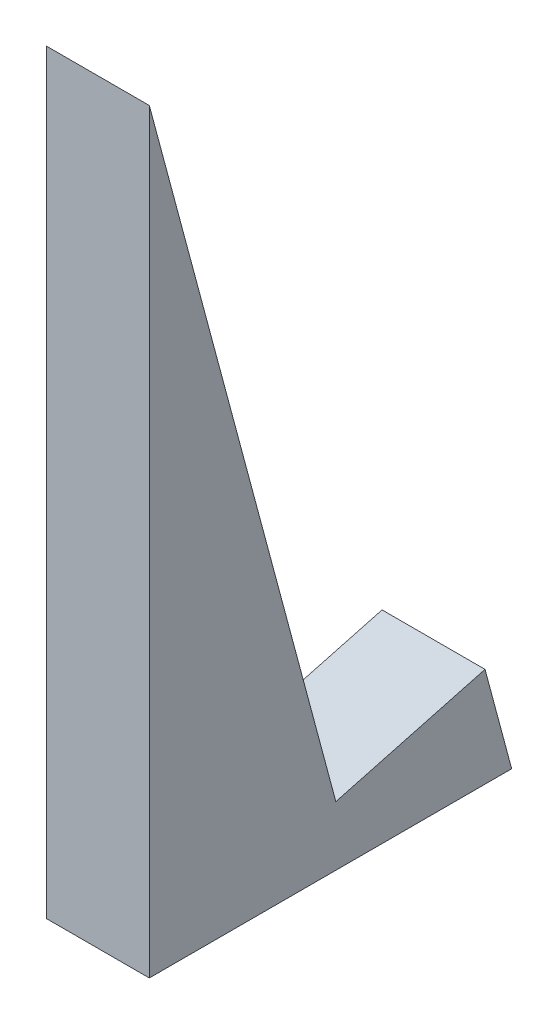
ISO-10303-21;
HEADER;
FILE_DESCRIPTION(('STEP AP214'),'2;1');
FILE_NAME('part.step','',(''),(''),'','','');
FILE_SCHEMA(('AUTOMOTIVE_DESIGN { 1 0 10303 214 1 1 1 1 }'));
ENDSEC;
DATA;
#1=APPLICATION_CONTEXT('core data for automotive mechanical design processes');
#2=APPLICATION_PROTOCOL_DEFINITION('international standard','automotive_design',2000,#1);
#3=PRODUCT_CONTEXT('',#1,'mechanical');
#4=PRODUCT('Part','Part','',(#3));
#5=PRODUCT_RELATED_PRODUCT_CATEGORY('part','',(#4));
#6=PRODUCT_DEFINITION_FORMATION('','',#4);
#7=PRODUCT_DEFINITION_CONTEXT('part definition',#1,'design');
#8=PRODUCT_DEFINITION('design','',#6,#7);
#9=PRODUCT_DEFINITION_SHAPE('','',#8);
#10=(LENGTH_UNIT() NAMED_UNIT(*) SI_UNIT(.MILLI.,.METRE.));
#11=(NAMED_UNIT(*) PLANE_ANGLE_UNIT() SI_UNIT($,.RADIAN.));
#12=(NAMED_UNIT(*) SI_UNIT($,.STERADIAN.) SOLID_ANGLE_UNIT());
#13=UNCERTAINTY_MEASURE_WITH_UNIT(LENGTH_MEASURE(1.E-05),#10,'distance_accuracy_value','');
#14=(GEOMETRIC_REPRESENTATION_CONTEXT(3) GLOBAL_UNCERTAINTY_ASSIGNED_CONTEXT((#13)) GLOBAL_UNIT_ASSIGNED_CONTEXT((#10,
#11,#12)) REPRESENTATION_CONTEXT('',''));
#15=CARTESIAN_POINT('',(0.,0.,0.));
#16=DIRECTION('',(0.,0.,1.));
#17=DIRECTION('',(1.,0.,0.));
#18=AXIS2_PLACEMENT_3D('',#15,#16,#17);
#19=CARTESIAN_POINT('',(10.,73.3917804265875,0.));
#20=DIRECTION('',(0.,0.,-1.));
#21=DIRECTION('',(0.,1.,0.));
#22=AXIS2_PLACEMENT_3D('',#19,#20,#21);
#23=PLANE('',#22);
#24=DIRECTION('',(0.,-1.,0.));
#25=VECTOR('',#24,1.);
#26=CARTESIAN_POINT('',(0.,73.3917804265875,0.));
#27=LINE('',#26,#25);
#28=CARTESIAN_POINT('',(0.,73.3917804265875,0.));
#29=VERTEX_POINT('',#28);
#30=CARTESIAN_POINT('',(0.,0.,0.));
#31=VERTEX_POINT('',#30);
#32=EDGE_CURVE('E107',#29,#31,#27,.T.);
#33=ORIENTED_EDGE('',*,*,#32,.T.);
#34=DIRECTION('',(-1.,0.,0.));
#35=VECTOR('',#34,1.);
#36=CARTESIAN_POINT('',(10.,0.,0.));
#37=LINE('',#36,#35);
#38=CARTESIAN_POINT('',(10.,0.,0.));
#39=VERTEX_POINT('',#38);
#40=EDGE_CURVE('E11',#39,#31,#37,.T.);
#41=ORIENTED_EDGE('',*,*,#40,.F.);
#42=DIRECTION('',(0.,-1.,0.));
#43=VECTOR('',#42,1.);
#44=CARTESIAN_POINT('',(10.,73.3917804265875,0.));
#45=LINE('',#44,#43);
#46=CARTESIAN_POINT('',(10.,73.3917804265875,0.));
#47=VERTEX_POINT('',#46);
#48=EDGE_CURVE('E115',#47,#39,#45,.T.);
#49=ORIENTED_EDGE('',*,*,#48,.F.);
#50=DIRECTION('',(-1.,0.,0.));
#51=VECTOR('',#50,1.);
#52=CARTESIAN_POINT('',(10.,73.3917804265875,0.));
#53=LINE('',#52,#51);
#54=EDGE_CURVE('E103',#47,#29,#53,.T.);
#55=ORIENTED_EDGE('',*,*,#54,.T.);
#56=EDGE_LOOP('',(#33,#41,#49,#55));
#57=FACE_BOUND('',#56,.T.);
#58=ADVANCED_FACE('F33',(#57),#23,.F.);
#59=CARTESIAN_POINT('',(10.,0.,0.));
#60=DIRECTION('',(0.,1.,0.));
#61=DIRECTION('',(0.,0.,1.));
#62=AXIS2_PLACEMENT_3D('',#59,#60,#61);
#63=PLANE('',#62);
#64=DIRECTION('',(0.,0.,-1.));
#65=VECTOR('',#64,1.);
#66=CARTESIAN_POINT('',(0.,0.,0.));
#67=LINE('',#66,#65);
#68=CARTESIAN_POINT('',(0.,0.,-35.1944110025381));
#69=VERTEX_POINT('',#68);
#70=EDGE_CURVE('E110',#31,#69,#67,.T.);
#71=ORIENTED_EDGE('',*,*,#70,.T.);
#72=DIRECTION('',(-1.,0.,0.));
#73=VECTOR('',#72,1.);
#74=CARTESIAN_POINT('',(10.,0.,-35.1944110025381));
#75=LINE('',#74,#73);
#76=CARTESIAN_POINT('',(10.,0.,-35.1944110025381));
#77=VERTEX_POINT('',#76);
#78=EDGE_CURVE('E41',#77,#69,#75,.T.);
#79=ORIENTED_EDGE('',*,*,#78,.F.);
#80=DIRECTION('',(0.,0.,-1.));
#81=VECTOR('',#80,1.);
#82=CARTESIAN_POINT('',(10.,0.,0.));
#83=LINE('',#82,#81);
#84=EDGE_CURVE('E83',#39,#77,#83,.T.);
#85=ORIENTED_EDGE('',*,*,#84,.F.);
#86=ORIENTED_EDGE('',*,*,#40,.T.);
#87=EDGE_LOOP('',(#71,#79,#85,#86));
#88=FACE_BOUND('',#87,.T.);
#89=ADVANCED_FACE('F134',(#88),#63,.F.);
#90=CARTESIAN_POINT('',(10.,0.,-35.1944110025381));
#91=DIRECTION('',(0.,-0.258819045102526,0.965925826289067));
#92=DIRECTION('',(0.,-0.965925826289067,-0.258819045102526));
#93=AXIS2_PLACEMENT_3D('',#90,#91,#92);
#94=PLANE('',#93);
#95=DIRECTION('',(0.,0.965925826289067,0.258819045102526));
#96=VECTOR('',#95,1.);
#97=CARTESIAN_POINT('',(0.,0.,-35.1944110025381));
#98=LINE('',#97,#96);
#99=CARTESIAN_POINT('',(0.,9.65925826289067,-32.6062205515128));
#100=VERTEX_POINT('',#99);
#101=EDGE_CURVE('E98',#69,#100,#98,.T.);
#102=ORIENTED_EDGE('',*,*,#101,.T.);
#103=DIRECTION('',(-1.,0.,0.));
#104=VECTOR('',#103,1.);
#105=CARTESIAN_POINT('',(10.,9.65925826289067,-32.6062205515128));
#106=LINE('',#105,#104);
#107=CARTESIAN_POINT('',(10.,9.65925826289067,-32.6062205515128));
#108=VERTEX_POINT('',#107);
#109=EDGE_CURVE('E95',#108,#100,#106,.T.);
#110=ORIENTED_EDGE('',*,*,#109,.F.);
#111=DIRECTION('',(0.,0.965925826289067,0.258819045102526));
#112=VECTOR('',#111,1.);
#113=CARTESIAN_POINT('',(10.,0.,-35.1944110025381));
#114=LINE('',#113,#112);
#115=EDGE_CURVE('E87',#77,#108,#114,.T.);
#116=ORIENTED_EDGE('',*,*,#115,.F.);
#117=ORIENTED_EDGE('',*,*,#78,.T.);
#118=EDGE_LOOP('',(#102,#110,#116,#117));
#119=FACE_BOUND('',#118,.T.);
#120=ADVANCED_FACE('F96',(#119),#94,.F.);
#121=CARTESIAN_POINT('',(10.,9.65925826289067,-32.6062205515128));
#122=DIRECTION('',(0.,-0.965925826289067,-0.258819045102526));
#123=DIRECTION('',(0.,0.258819045102526,-0.965925826289067));
#124=AXIS2_PLACEMENT_3D('',#121,#122,#123);
#125=PLANE('',#124);
#126=DIRECTION('',(0.,-0.258819045102526,0.965925826289067));
#127=VECTOR('',#126,1.);
#128=CARTESIAN_POINT('',(0.,9.65925826289067,-32.6062205515128));
#129=LINE('',#128,#127);
#130=CARTESIAN_POINT('',(0.,5.77697258635278,-18.1173331571768));
#131=VERTEX_POINT('',#130);
#132=EDGE_CURVE('E69',#100,#131,#129,.T.);
#133=ORIENTED_EDGE('',*,*,#132,.T.);
#134=DIRECTION('',(-1.,0.,0.));
#135=VECTOR('',#134,1.);
#136=CARTESIAN_POINT('',(10.,5.77697258635278,-18.1173331571768));
#137=LINE('',#136,#135);
#138=CARTESIAN_POINT('',(10.,5.77697258635278,-18.1173331571768));
#139=VERTEX_POINT('',#138);
#140=EDGE_CURVE('E99',#139,#131,#137,.T.);
#141=ORIENTED_EDGE('',*,*,#140,.F.);
#142=DIRECTION('',(0.,-0.258819045102526,0.965925826289067));
#143=VECTOR('',#142,1.);
#144=CARTESIAN_POINT('',(10.,9.65925826289067,-32.6062205515128));
#145=LINE('',#144,#143);
#146=EDGE_CURVE('E91',#108,#139,#145,.T.);
#147=ORIENTED_EDGE('',*,*,#146,.F.);
#148=ORIENTED_EDGE('',*,*,#109,.T.);
#149=EDGE_LOOP('',(#133,#141,#147,#148));
#150=FACE_BOUND('',#149,.T.);
#151=ADVANCED_FACE('F101',(#150),#125,.F.);
#152=CARTESIAN_POINT('',(10.,5.77697258635278,-18.1173331571768));
#153=DIRECTION('',(0.,-0.258819045102526,0.965925826289067));
#154=DIRECTION('',(0.,-0.965925826289067,-0.258819045102526));
#155=AXIS2_PLACEMENT_3D('',#152,#153,#154);
#156=PLANE('',#155);
#157=DIRECTION('',(0.,0.965925826289067,0.258819045102526));
#158=VECTOR('',#157,1.);
#159=CARTESIAN_POINT('',(0.,5.77697258635278,-18.1173331571768));
#160=LINE('',#159,#158);
#161=EDGE_CURVE('E75',#131,#29,#160,.T.);
#162=ORIENTED_EDGE('',*,*,#161,.T.);
#163=ORIENTED_EDGE('',*,*,#54,.F.);
#164=DIRECTION('',(0.,0.965925826289067,0.258819045102526));
#165=VECTOR('',#164,1.);
#166=CARTESIAN_POINT('',(10.,5.77697258635278,-18.1173331571768));
#167=LINE('',#166,#165);
#168=EDGE_CURVE('E49',#139,#47,#167,.T.);
#169=ORIENTED_EDGE('',*,*,#168,.F.);
#170=ORIENTED_EDGE('',*,*,#140,.T.);
#171=EDGE_LOOP('',(#162,#163,#169,#170));
#172=FACE_BOUND('',#171,.T.);
#173=ADVANCED_FACE('F123',(#172),#156,.F.);
#174=CARTESIAN_POINT('',(10.,0.,0.));
#175=DIRECTION('',(1.,0.,0.));
#176=DIRECTION('',(0.,0.,-1.));
#177=AXIS2_PLACEMENT_3D('',#174,#175,#176);
#178=PLANE('',#177);
#179=ORIENTED_EDGE('',*,*,#48,.T.);
#180=ORIENTED_EDGE('',*,*,#84,.T.);
#181=ORIENTED_EDGE('',*,*,#115,.T.);
#182=ORIENTED_EDGE('',*,*,#146,.T.);
#183=ORIENTED_EDGE('',*,*,#168,.T.);
#184=EDGE_LOOP('',(#179,#180,#181,#182,#183));
#185=FACE_BOUND('',#184,.T.);
#186=ADVANCED_FACE('F89',(#185),#178,.T.);
#187=CARTESIAN_POINT('',(0.,0.,0.));
#188=DIRECTION('',(1.,0.,0.));
#189=DIRECTION('',(0.,0.,-1.));
#190=AXIS2_PLACEMENT_3D('',#187,#188,#189);
#191=PLANE('',#190);
#192=ORIENTED_EDGE('',*,*,#32,.F.);
#193=ORIENTED_EDGE('',*,*,#161,.F.);
#194=ORIENTED_EDGE('',*,*,#132,.F.);
#195=ORIENTED_EDGE('',*,*,#101,.F.);
#196=ORIENTED_EDGE('',*,*,#70,.F.);
#197=EDGE_LOOP('',(#192,#193,#194,#195,#196));
#198=FACE_BOUND('',#197,.T.);
#199=ADVANCED_FACE('F119',(#198),#191,.F.);
#200=CLOSED_SHELL('',(#58,#89,#120,#151,#173,#186,#199));
#201=MANIFOLD_SOLID_BREP('B2',#200);
#202=ADVANCED_BREP_SHAPE_REPRESENTATION('',(#18,#201),#14);
#203=SHAPE_DEFINITION_REPRESENTATION(#9,#202);
ENDSEC;
END-ISO-10303-21;
